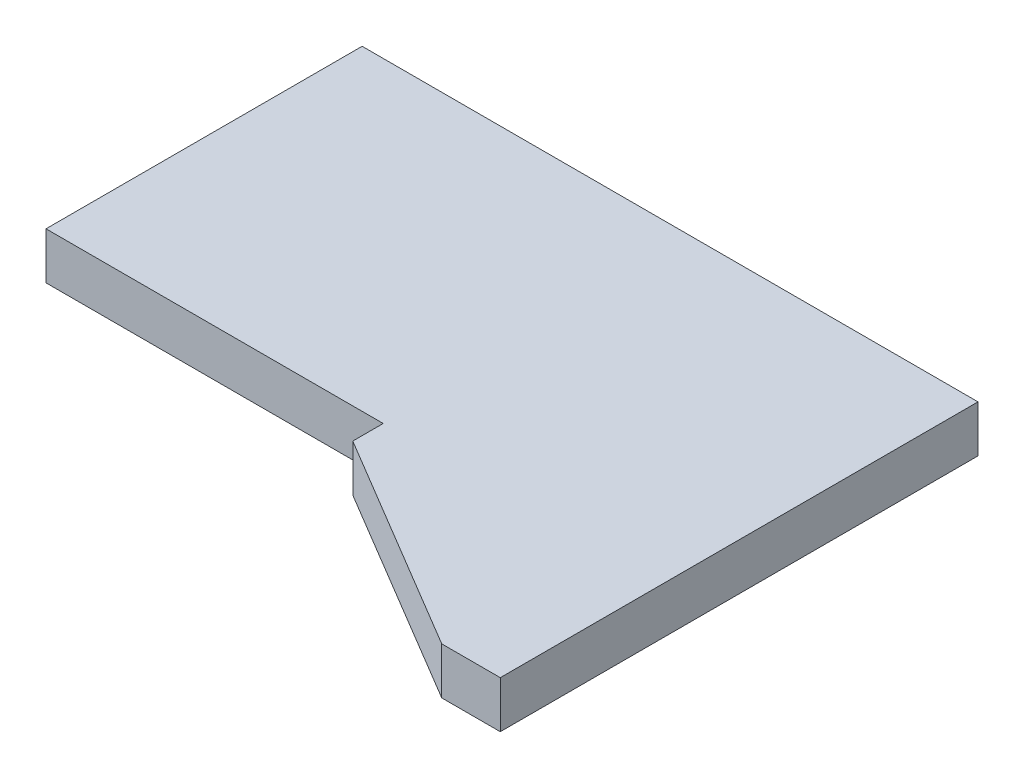
ISO-10303-21;
HEADER;
FILE_DESCRIPTION(('STEP AP214'),'2;1');
FILE_NAME('part.step','',(''),(''),'','','');
FILE_SCHEMA(('AUTOMOTIVE_DESIGN { 1 0 10303 214 1 1 1 1 }'));
ENDSEC;
DATA;
#1=APPLICATION_CONTEXT('core data for automotive mechanical design processes');
#2=APPLICATION_PROTOCOL_DEFINITION('international standard','automotive_design',2000,#1);
#3=PRODUCT_CONTEXT('',#1,'mechanical');
#4=PRODUCT('Part','Part','',(#3));
#5=PRODUCT_RELATED_PRODUCT_CATEGORY('part','',(#4));
#6=PRODUCT_DEFINITION_FORMATION('','',#4);
#7=PRODUCT_DEFINITION_CONTEXT('part definition',#1,'design');
#8=PRODUCT_DEFINITION('design','',#6,#7);
#9=PRODUCT_DEFINITION_SHAPE('','',#8);
#10=(LENGTH_UNIT() NAMED_UNIT(*) SI_UNIT(.MILLI.,.METRE.));
#11=(NAMED_UNIT(*) PLANE_ANGLE_UNIT() SI_UNIT($,.RADIAN.));
#12=(NAMED_UNIT(*) SI_UNIT($,.STERADIAN.) SOLID_ANGLE_UNIT());
#13=UNCERTAINTY_MEASURE_WITH_UNIT(LENGTH_MEASURE(1.E-05),#10,'distance_accuracy_value','');
#14=(GEOMETRIC_REPRESENTATION_CONTEXT(3) GLOBAL_UNCERTAINTY_ASSIGNED_CONTEXT((#13)) GLOBAL_UNIT_ASSIGNED_CONTEXT((#10,
#11,#12)) REPRESENTATION_CONTEXT('',''));
#15=CARTESIAN_POINT('',(0.,0.,0.));
#16=DIRECTION('',(0.,0.,1.));
#17=DIRECTION('',(1.,0.,0.));
#18=AXIS2_PLACEMENT_3D('',#15,#16,#17);
#19=CARTESIAN_POINT('',(0.,10.,0.));
#20=DIRECTION('',(1.,0.,0.));
#21=DIRECTION('',(0.,0.,-1.));
#22=AXIS2_PLACEMENT_3D('',#19,#20,#21);
#23=PLANE('',#22);
#24=DIRECTION('',(0.,0.,1.));
#25=VECTOR('',#24,1.);
#26=CARTESIAN_POINT('',(0.,0.,0.));
#27=LINE('',#26,#25);
#28=CARTESIAN_POINT('',(0.,0.,0.));
#29=VERTEX_POINT('',#28);
#30=CARTESIAN_POINT('',(0.,0.,67.5));
#31=VERTEX_POINT('',#30);
#32=EDGE_CURVE('E140',#29,#31,#27,.T.);
#33=ORIENTED_EDGE('',*,*,#32,.T.);
#34=DIRECTION('',(0.,-1.,0.));
#35=VECTOR('',#34,1.);
#36=CARTESIAN_POINT('',(0.,10.,67.5));
#37=LINE('',#36,#35);
#38=CARTESIAN_POINT('',(0.,10.,67.5));
#39=VERTEX_POINT('',#38);
#40=EDGE_CURVE('E11',#39,#31,#37,.T.);
#41=ORIENTED_EDGE('',*,*,#40,.F.);
#42=DIRECTION('',(0.,0.,1.));
#43=VECTOR('',#42,1.);
#44=CARTESIAN_POINT('',(0.,10.,0.));
#45=LINE('',#44,#43);
#46=CARTESIAN_POINT('',(0.,10.,0.));
#47=VERTEX_POINT('',#46);
#48=EDGE_CURVE('E159',#47,#39,#45,.T.);
#49=ORIENTED_EDGE('',*,*,#48,.F.);
#50=DIRECTION('',(0.,-1.,0.));
#51=VECTOR('',#50,1.);
#52=CARTESIAN_POINT('',(0.,10.,0.));
#53=LINE('',#52,#51);
#54=EDGE_CURVE('E136',#47,#29,#53,.T.);
#55=ORIENTED_EDGE('',*,*,#54,.T.);
#56=EDGE_LOOP('',(#33,#41,#49,#55));
#57=FACE_BOUND('',#56,.T.);
#58=ADVANCED_FACE('F45',(#57),#23,.F.);
#59=CARTESIAN_POINT('',(0.,10.,67.5));
#60=DIRECTION('',(0.,0.,-1.));
#61=DIRECTION('',(-1.,0.,0.));
#62=AXIS2_PLACEMENT_3D('',#59,#60,#61);
#63=PLANE('',#62);
#64=DIRECTION('',(1.,0.,0.));
#65=VECTOR('',#64,1.);
#66=CARTESIAN_POINT('',(0.,0.,67.5));
#67=LINE('',#66,#65);
#68=CARTESIAN_POINT('',(72.,0.,67.5));
#69=VERTEX_POINT('',#68);
#70=EDGE_CURVE('E144',#31,#69,#67,.T.);
#71=ORIENTED_EDGE('',*,*,#70,.T.);
#72=DIRECTION('',(0.,-1.,0.));
#73=VECTOR('',#72,1.);
#74=CARTESIAN_POINT('',(72.,10.,67.5));
#75=LINE('',#74,#73);
#76=CARTESIAN_POINT('',(72.,10.,67.5));
#77=VERTEX_POINT('',#76);
#78=EDGE_CURVE('E54',#77,#69,#75,.T.);
#79=ORIENTED_EDGE('',*,*,#78,.F.);
#80=DIRECTION('',(1.,0.,0.));
#81=VECTOR('',#80,1.);
#82=CARTESIAN_POINT('',(0.,10.,67.5));
#83=LINE('',#82,#81);
#84=EDGE_CURVE('E102',#39,#77,#83,.T.);
#85=ORIENTED_EDGE('',*,*,#84,.F.);
#86=ORIENTED_EDGE('',*,*,#40,.T.);
#87=EDGE_LOOP('',(#71,#79,#85,#86));
#88=FACE_BOUND('',#87,.T.);
#89=ADVANCED_FACE('F193',(#88),#63,.F.);
#90=CARTESIAN_POINT('',(72.,10.,67.5));
#91=DIRECTION('',(1.,0.,0.));
#92=DIRECTION('',(0.,0.,-1.));
#93=AXIS2_PLACEMENT_3D('',#90,#91,#92);
#94=PLANE('',#93);
#95=DIRECTION('',(0.,0.,1.));
#96=VECTOR('',#95,1.);
#97=CARTESIAN_POINT('',(72.,0.,67.5));
#98=LINE('',#97,#96);
#99=CARTESIAN_POINT('',(72.,0.,74.));
#100=VERTEX_POINT('',#99);
#101=EDGE_CURVE('E147',#69,#100,#98,.T.);
#102=ORIENTED_EDGE('',*,*,#101,.T.);
#103=DIRECTION('',(0.,-1.,0.));
#104=VECTOR('',#103,1.);
#105=CARTESIAN_POINT('',(72.,10.,74.));
#106=LINE('',#105,#104);
#107=CARTESIAN_POINT('',(72.,10.,74.));
#108=VERTEX_POINT('',#107);
#109=EDGE_CURVE('E166',#108,#100,#106,.T.);
#110=ORIENTED_EDGE('',*,*,#109,.F.);
#111=DIRECTION('',(0.,0.,1.));
#112=VECTOR('',#111,1.);
#113=CARTESIAN_POINT('',(72.,10.,67.5));
#114=LINE('',#113,#112);
#115=EDGE_CURVE('E176',#77,#108,#114,.T.);
#116=ORIENTED_EDGE('',*,*,#115,.F.);
#117=ORIENTED_EDGE('',*,*,#78,.T.);
#118=EDGE_LOOP('',(#102,#110,#116,#117));
#119=FACE_BOUND('',#118,.T.);
#120=ADVANCED_FACE('F174',(#119),#94,.F.);
#121=CARTESIAN_POINT('',(72.,10.,74.));
#122=DIRECTION('',(0.511805175094578,0.,-0.859101543908756));
#123=DIRECTION('',(-0.859101543908756,0.,-0.511805175094578));
#124=AXIS2_PLACEMENT_3D('',#121,#122,#123);
#125=PLANE('',#124);
#126=DIRECTION('',(0.859101543908756,0.,0.511805175094578));
#127=VECTOR('',#126,1.);
#128=CARTESIAN_POINT('',(72.,0.,74.));
#129=LINE('',#128,#127);
#130=CARTESIAN_POINT('',(119.,0.,102.));
#131=VERTEX_POINT('',#130);
#132=EDGE_CURVE('E150',#100,#131,#129,.T.);
#133=ORIENTED_EDGE('',*,*,#132,.T.);
#134=DIRECTION('',(0.,-1.,0.));
#135=VECTOR('',#134,1.);
#136=CARTESIAN_POINT('',(119.,10.,102.));
#137=LINE('',#136,#135);
#138=CARTESIAN_POINT('',(119.,10.,102.));
#139=VERTEX_POINT('',#138);
#140=EDGE_CURVE('E129',#139,#131,#137,.T.);
#141=ORIENTED_EDGE('',*,*,#140,.F.);
#142=DIRECTION('',(0.859101543908756,0.,0.511805175094578));
#143=VECTOR('',#142,1.);
#144=CARTESIAN_POINT('',(72.,10.,74.));
#145=LINE('',#144,#143);
#146=EDGE_CURVE('E118',#108,#139,#145,.T.);
#147=ORIENTED_EDGE('',*,*,#146,.F.);
#148=ORIENTED_EDGE('',*,*,#109,.T.);
#149=EDGE_LOOP('',(#133,#141,#147,#148));
#150=FACE_BOUND('',#149,.T.);
#151=ADVANCED_FACE('F182',(#150),#125,.F.);
#152=CARTESIAN_POINT('',(131.5,10.,102.));
#153=DIRECTION('',(0.,0.,-1.));
#154=DIRECTION('',(-1.,0.,0.));
#155=AXIS2_PLACEMENT_3D('',#152,#153,#154);
#156=PLANE('',#155);
#157=DIRECTION('',(1.,0.,0.));
#158=VECTOR('',#157,1.);
#159=CARTESIAN_POINT('',(131.5,0.,102.));
#160=LINE('',#159,#158);
#161=CARTESIAN_POINT('',(131.5,0.,102.));
#162=VERTEX_POINT('',#161);
#163=EDGE_CURVE('E127',#131,#162,#160,.T.);
#164=ORIENTED_EDGE('',*,*,#163,.T.);
#165=DIRECTION('',(0.,-1.,0.));
#166=VECTOR('',#165,1.);
#167=CARTESIAN_POINT('',(131.5,10.,102.));
#168=LINE('',#167,#166);
#169=CARTESIAN_POINT('',(131.5,10.,102.));
#170=VERTEX_POINT('',#169);
#171=EDGE_CURVE('E124',#170,#162,#168,.T.);
#172=ORIENTED_EDGE('',*,*,#171,.F.);
#173=DIRECTION('',(1.,0.,0.));
#174=VECTOR('',#173,1.);
#175=CARTESIAN_POINT('',(131.5,10.,102.));
#176=LINE('',#175,#174);
#177=EDGE_CURVE('E112',#139,#170,#176,.T.);
#178=ORIENTED_EDGE('',*,*,#177,.F.);
#179=ORIENTED_EDGE('',*,*,#140,.T.);
#180=EDGE_LOOP('',(#164,#172,#178,#179));
#181=FACE_BOUND('',#180,.T.);
#182=ADVANCED_FACE('F125',(#181),#156,.F.);
#183=CARTESIAN_POINT('',(131.5,10.,0.));
#184=DIRECTION('',(-1.,0.,0.));
#185=DIRECTION('',(0.,0.,1.));
#186=AXIS2_PLACEMENT_3D('',#183,#184,#185);
#187=PLANE('',#186);
#188=DIRECTION('',(0.,0.,-1.));
#189=VECTOR('',#188,1.);
#190=CARTESIAN_POINT('',(131.5,0.,0.));
#191=LINE('',#190,#189);
#192=CARTESIAN_POINT('',(131.5,0.,0.));
#193=VERTEX_POINT('',#192);
#194=EDGE_CURVE('E88',#162,#193,#191,.T.);
#195=ORIENTED_EDGE('',*,*,#194,.T.);
#196=DIRECTION('',(0.,-1.,0.));
#197=VECTOR('',#196,1.);
#198=CARTESIAN_POINT('',(131.5,10.,0.));
#199=LINE('',#198,#197);
#200=CARTESIAN_POINT('',(131.5,10.,0.));
#201=VERTEX_POINT('',#200);
#202=EDGE_CURVE('E130',#201,#193,#199,.T.);
#203=ORIENTED_EDGE('',*,*,#202,.F.);
#204=DIRECTION('',(0.,0.,-1.));
#205=VECTOR('',#204,1.);
#206=CARTESIAN_POINT('',(131.5,10.,0.));
#207=LINE('',#206,#205);
#208=EDGE_CURVE('E116',#170,#201,#207,.T.);
#209=ORIENTED_EDGE('',*,*,#208,.F.);
#210=ORIENTED_EDGE('',*,*,#171,.T.);
#211=EDGE_LOOP('',(#195,#203,#209,#210));
#212=FACE_BOUND('',#211,.T.);
#213=ADVANCED_FACE('F132',(#212),#187,.F.);
#214=CARTESIAN_POINT('',(0.,10.,0.));
#215=DIRECTION('',(0.,0.,1.));
#216=DIRECTION('',(1.,0.,0.));
#217=AXIS2_PLACEMENT_3D('',#214,#215,#216);
#218=PLANE('',#217);
#219=DIRECTION('',(-1.,0.,0.));
#220=VECTOR('',#219,1.);
#221=CARTESIAN_POINT('',(0.,0.,0.));
#222=LINE('',#221,#220);
#223=EDGE_CURVE('E94',#193,#29,#222,.T.);
#224=ORIENTED_EDGE('',*,*,#223,.T.);
#225=ORIENTED_EDGE('',*,*,#54,.F.);
#226=DIRECTION('',(-1.,0.,0.));
#227=VECTOR('',#226,1.);
#228=CARTESIAN_POINT('',(0.,10.,0.));
#229=LINE('',#228,#227);
#230=EDGE_CURVE('E62',#201,#47,#229,.T.);
#231=ORIENTED_EDGE('',*,*,#230,.F.);
#232=ORIENTED_EDGE('',*,*,#202,.T.);
#233=EDGE_LOOP('',(#224,#225,#231,#232));
#234=FACE_BOUND('',#233,.T.);
#235=ADVANCED_FACE('F207',(#234),#218,.F.);
#236=CARTESIAN_POINT('',(0.,10.,0.));
#237=DIRECTION('',(0.,1.,0.));
#238=DIRECTION('',(0.,0.,1.));
#239=AXIS2_PLACEMENT_3D('',#236,#237,#238);
#240=PLANE('',#239);
#241=ORIENTED_EDGE('',*,*,#48,.T.);
#242=ORIENTED_EDGE('',*,*,#84,.T.);
#243=ORIENTED_EDGE('',*,*,#115,.T.);
#244=ORIENTED_EDGE('',*,*,#146,.T.);
#245=ORIENTED_EDGE('',*,*,#177,.T.);
#246=ORIENTED_EDGE('',*,*,#208,.T.);
#247=ORIENTED_EDGE('',*,*,#230,.T.);
#248=EDGE_LOOP('',(#241,#242,#243,#244,#245,#246,#247));
#249=FACE_BOUND('',#248,.T.);
#250=ADVANCED_FACE('F114',(#249),#240,.T.);
#251=CARTESIAN_POINT('',(0.,0.,0.));
#252=DIRECTION('',(0.,1.,0.));
#253=DIRECTION('',(0.,0.,1.));
#254=AXIS2_PLACEMENT_3D('',#251,#252,#253);
#255=PLANE('',#254);
#256=ORIENTED_EDGE('',*,*,#32,.F.);
#257=ORIENTED_EDGE('',*,*,#223,.F.);
#258=ORIENTED_EDGE('',*,*,#194,.F.);
#259=ORIENTED_EDGE('',*,*,#163,.F.);
#260=ORIENTED_EDGE('',*,*,#132,.F.);
#261=ORIENTED_EDGE('',*,*,#101,.F.);
#262=ORIENTED_EDGE('',*,*,#70,.F.);
#263=EDGE_LOOP('',(#256,#257,#258,#259,#260,#261,#262));
#264=FACE_BOUND('',#263,.T.);
#265=ADVANCED_FACE('F180',(#264),#255,.F.);
#266=CLOSED_SHELL('',(#58,#89,#120,#151,#182,#213,#235,#250,#265));
#267=MANIFOLD_SOLID_BREP('B2',#266);
#268=ADVANCED_BREP_SHAPE_REPRESENTATION('',(#18,#267),#14);
#269=SHAPE_DEFINITION_REPRESENTATION(#9,#268);
ENDSEC;
END-ISO-10303-21;
